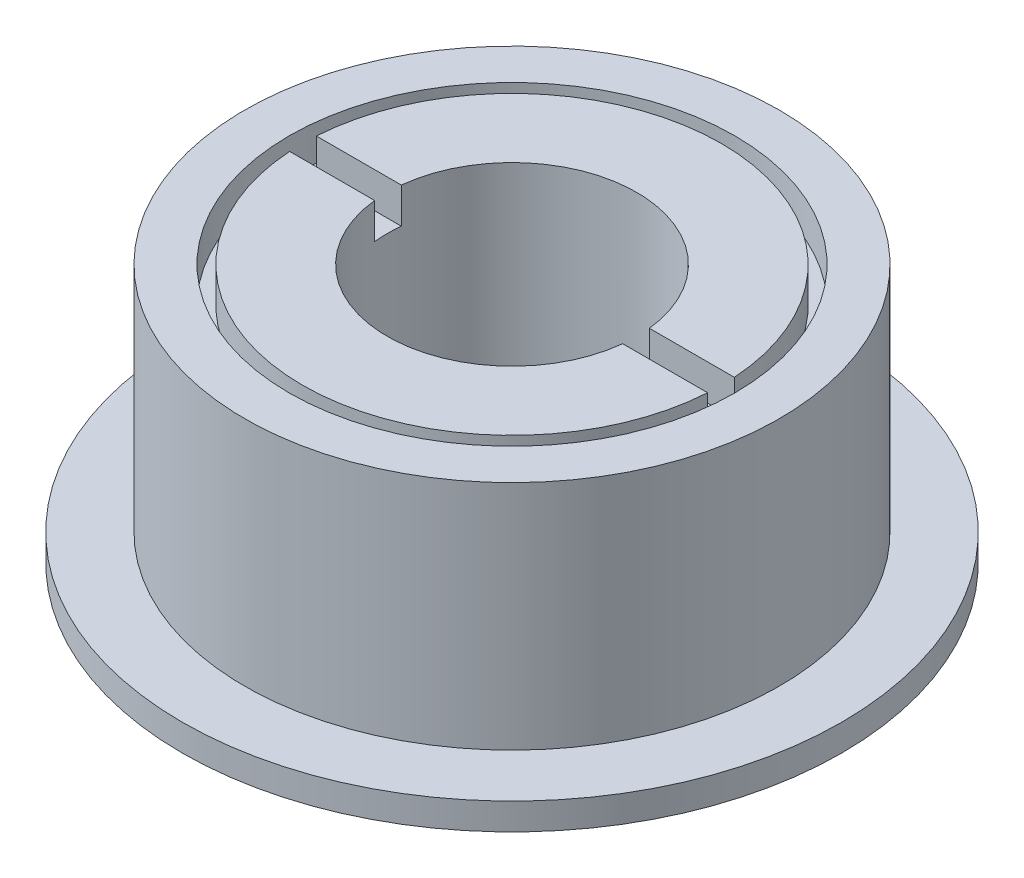
ISO-10303-21;
HEADER;
FILE_DESCRIPTION(('STEP AP214'),'2;1');
FILE_NAME('part.step','',(''),(''),'','','');
FILE_SCHEMA(('AUTOMOTIVE_DESIGN { 1 0 10303 214 1 1 1 1 }'));
ENDSEC;
DATA;
#1=APPLICATION_CONTEXT('core data for automotive mechanical design processes');
#2=APPLICATION_PROTOCOL_DEFINITION('international standard','automotive_design',2000,#1);
#3=PRODUCT_CONTEXT('',#1,'mechanical');
#4=PRODUCT('Part','Part','',(#3));
#5=PRODUCT_RELATED_PRODUCT_CATEGORY('part','',(#4));
#6=PRODUCT_DEFINITION_FORMATION('','',#4);
#7=PRODUCT_DEFINITION_CONTEXT('part definition',#1,'design');
#8=PRODUCT_DEFINITION('design','',#6,#7);
#9=PRODUCT_DEFINITION_SHAPE('','',#8);
#10=(LENGTH_UNIT() NAMED_UNIT(*) SI_UNIT(.MILLI.,.METRE.));
#11=(NAMED_UNIT(*) PLANE_ANGLE_UNIT() SI_UNIT($,.RADIAN.));
#12=(NAMED_UNIT(*) SI_UNIT($,.STERADIAN.) SOLID_ANGLE_UNIT());
#13=UNCERTAINTY_MEASURE_WITH_UNIT(LENGTH_MEASURE(1.E-05),#10,'distance_accuracy_value','');
#14=(GEOMETRIC_REPRESENTATION_CONTEXT(3) GLOBAL_UNCERTAINTY_ASSIGNED_CONTEXT((#13)) GLOBAL_UNIT_ASSIGNED_CONTEXT((#10,
#11,#12)) REPRESENTATION_CONTEXT('',''));
#15=CARTESIAN_POINT('',(0.,0.,0.));
#16=DIRECTION('',(0.,0.,1.));
#17=DIRECTION('',(1.,0.,0.));
#18=AXIS2_PLACEMENT_3D('',#15,#16,#17);
#19=CARTESIAN_POINT('',(0.,3.,0.));
#20=DIRECTION('',(0.,-1.,0.));
#21=DIRECTION('',(0.,0.,-1.));
#22=AXIS2_PLACEMENT_3D('',#19,#20,#21);
#23=CYLINDRICAL_SURFACE('',#22,37.);
#24=CARTESIAN_POINT('',(0.,3.,0.));
#25=DIRECTION('',(0.,1.,0.));
#26=DIRECTION('',(0.,0.,1.));
#27=AXIS2_PLACEMENT_3D('',#24,#25,#26);
#28=CIRCLE('',#27,37.);
#29=CARTESIAN_POINT('',(0.,3.,37.));
#30=VERTEX_POINT('',#29);
#31=EDGE_CURVE('E50',#30,#30,#28,.T.);
#32=ORIENTED_EDGE('',*,*,#31,.F.);
#33=EDGE_LOOP('',(#32));
#34=FACE_BOUND('',#33,.T.);
#35=CARTESIAN_POINT('',(0.,0.,0.));
#36=DIRECTION('',(0.,1.,0.));
#37=DIRECTION('',(0.,0.,1.));
#38=AXIS2_PLACEMENT_3D('',#35,#36,#37);
#39=CIRCLE('',#38,37.);
#40=CARTESIAN_POINT('',(0.,0.,37.));
#41=VERTEX_POINT('',#40);
#42=EDGE_CURVE('E201',#41,#41,#39,.T.);
#43=ORIENTED_EDGE('',*,*,#42,.T.);
#44=EDGE_LOOP('',(#43));
#45=FACE_BOUND('',#44,.T.);
#46=ADVANCED_FACE('F41',(#34,#45),#23,.T.);
#47=CARTESIAN_POINT('',(0.,3.,0.));
#48=DIRECTION('',(0.,1.,0.));
#49=DIRECTION('',(0.,0.,1.));
#50=AXIS2_PLACEMENT_3D('',#47,#48,#49);
#51=PLANE('',#50);
#52=CARTESIAN_POINT('',(0.,3.,0.));
#53=DIRECTION('',(0.,1.,0.));
#54=DIRECTION('',(0.,0.,1.));
#55=AXIS2_PLACEMENT_3D('',#52,#53,#54);
#56=CIRCLE('',#55,30.);
#57=CARTESIAN_POINT('',(0.,3.,-30.));
#58=VERTEX_POINT('',#57);
#59=EDGE_CURVE('E198',#58,#58,#56,.F.);
#60=ORIENTED_EDGE('',*,*,#59,.T.);
#61=EDGE_LOOP('',(#60));
#62=FACE_BOUND('',#61,.T.);
#63=ORIENTED_EDGE('',*,*,#31,.T.);
#64=EDGE_LOOP('',(#63));
#65=FACE_BOUND('',#64,.T.);
#66=ADVANCED_FACE('F238',(#62,#65),#51,.T.);
#67=CARTESIAN_POINT('',(0.,0.,0.));
#68=DIRECTION('',(0.,1.,0.));
#69=DIRECTION('',(0.,0.,1.));
#70=AXIS2_PLACEMENT_3D('',#67,#68,#69);
#71=PLANE('',#70);
#72=CARTESIAN_POINT('',(-8.,0.,0.));
#73=DIRECTION('',(0.,-1.,0.));
#74=DIRECTION('',(0.,0.,-1.));
#75=AXIS2_PLACEMENT_3D('',#72,#73,#74);
#76=CIRCLE('',#75,2.);
#77=CARTESIAN_POINT('',(-8.,0.,-2.));
#78=VERTEX_POINT('',#77);
#79=EDGE_CURVE('E283',#78,#78,#76,.T.);
#80=ORIENTED_EDGE('',*,*,#79,.F.);
#81=EDGE_LOOP('',(#80));
#82=FACE_BOUND('',#81,.T.);
#83=CARTESIAN_POINT('',(0.,0.,8.));
#84=DIRECTION('',(0.,-1.,0.));
#85=DIRECTION('',(0.,0.,-1.));
#86=AXIS2_PLACEMENT_3D('',#83,#84,#85);
#87=CIRCLE('',#86,2.);
#88=CARTESIAN_POINT('',(0.,0.,6.));
#89=VERTEX_POINT('',#88);
#90=EDGE_CURVE('E287',#89,#89,#87,.T.);
#91=ORIENTED_EDGE('',*,*,#90,.F.);
#92=EDGE_LOOP('',(#91));
#93=FACE_BOUND('',#92,.T.);
#94=CARTESIAN_POINT('',(8.,0.,0.));
#95=DIRECTION('',(0.,-1.,0.));
#96=DIRECTION('',(0.,0.,-1.));
#97=AXIS2_PLACEMENT_3D('',#94,#95,#96);
#98=CIRCLE('',#97,2.);
#99=CARTESIAN_POINT('',(8.,0.,-2.00000000000006));
#100=VERTEX_POINT('',#99);
#101=EDGE_CURVE('E291',#100,#100,#98,.T.);
#102=ORIENTED_EDGE('',*,*,#101,.F.);
#103=EDGE_LOOP('',(#102));
#104=FACE_BOUND('',#103,.T.);
#105=CARTESIAN_POINT('',(0.,0.,-8.));
#106=DIRECTION('',(0.,-1.,0.));
#107=DIRECTION('',(0.,0.,-1.));
#108=AXIS2_PLACEMENT_3D('',#105,#106,#107);
#109=CIRCLE('',#108,2.);
#110=CARTESIAN_POINT('',(0.,0.,-10.));
#111=VERTEX_POINT('',#110);
#112=EDGE_CURVE('E295',#111,#111,#109,.T.);
#113=ORIENTED_EDGE('',*,*,#112,.F.);
#114=EDGE_LOOP('',(#113));
#115=FACE_BOUND('',#114,.T.);
#116=CARTESIAN_POINT('',(0.,0.,0.));
#117=DIRECTION('',(0.,-1.,0.));
#118=DIRECTION('',(0.,0.,-1.));
#119=AXIS2_PLACEMENT_3D('',#116,#117,#118);
#120=CIRCLE('',#119,4.);
#121=CARTESIAN_POINT('',(0.,0.,-4.));
#122=VERTEX_POINT('',#121);
#123=EDGE_CURVE('E214',#122,#122,#120,.T.);
#124=ORIENTED_EDGE('',*,*,#123,.F.);
#125=EDGE_LOOP('',(#124));
#126=FACE_BOUND('',#125,.T.);
#127=ORIENTED_EDGE('',*,*,#42,.F.);
#128=EDGE_LOOP('',(#127));
#129=FACE_BOUND('',#128,.T.);
#130=ADVANCED_FACE('F267',(#82,#93,#104,#115,#126,#129),#71,.F.);
#131=CARTESIAN_POINT('',(0.,29.,0.));
#132=DIRECTION('',(0.,-1.,0.));
#133=DIRECTION('',(0.,0.,-1.));
#134=AXIS2_PLACEMENT_3D('',#131,#132,#133);
#135=CYLINDRICAL_SURFACE('',#134,30.);
#136=CARTESIAN_POINT('',(0.,29.,0.));
#137=DIRECTION('',(0.,1.,0.));
#138=DIRECTION('',(0.,0.,1.));
#139=AXIS2_PLACEMENT_3D('',#136,#137,#138);
#140=CIRCLE('',#139,30.);
#141=CARTESIAN_POINT('',(0.,29.,-30.));
#142=VERTEX_POINT('',#141);
#143=EDGE_CURVE('E194',#142,#142,#140,.T.);
#144=CARTESIAN_POINT('',(0.,3.,-30.));
#145=CARTESIAN_POINT('',(0.,3.27083333333333,-30.));
#146=CARTESIAN_POINT('',(0.,3.54166666666666,-30.));
#147=CARTESIAN_POINT('',(0.,4.08333333333333,-30.));
#148=CARTESIAN_POINT('',(0.,4.35416666666666,-30.));
#149=CARTESIAN_POINT('',(0.,4.89583333333333,-30.));
#150=CARTESIAN_POINT('',(0.,5.16666666666666,-30.));
#151=CARTESIAN_POINT('',(0.,5.70833333333333,-30.));
#152=CARTESIAN_POINT('',(0.,5.97916666666667,-30.));
#153=CARTESIAN_POINT('',(0.,6.52083333333333,-30.));
#154=CARTESIAN_POINT('',(0.,6.79166666666667,-30.));
#155=CARTESIAN_POINT('',(0.,7.33333333333333,-30.));
#156=CARTESIAN_POINT('',(0.,7.60416666666666,-30.));
#157=CARTESIAN_POINT('',(0.,8.14583333333333,-30.));
#158=CARTESIAN_POINT('',(0.,8.41666666666666,-30.));
#159=CARTESIAN_POINT('',(0.,8.95833333333333,-30.));
#160=CARTESIAN_POINT('',(0.,9.22916666666666,-30.));
#161=CARTESIAN_POINT('',(0.,9.77083333333333,-30.));
#162=CARTESIAN_POINT('',(0.,10.0416666666667,-30.));
#163=CARTESIAN_POINT('',(0.,10.5833333333333,-30.));
#164=CARTESIAN_POINT('',(0.,10.8541666666667,-30.));
#165=CARTESIAN_POINT('',(0.,11.3958333333333,-30.));
#166=CARTESIAN_POINT('',(0.,11.6666666666667,-30.));
#167=CARTESIAN_POINT('',(0.,12.2083333333333,-30.));
#168=CARTESIAN_POINT('',(0.,12.4791666666667,-30.));
#169=CARTESIAN_POINT('',(0.,13.0208333333333,-30.));
#170=CARTESIAN_POINT('',(0.,13.2916666666667,-30.));
#171=CARTESIAN_POINT('',(0.,13.8333333333333,-30.));
#172=CARTESIAN_POINT('',(0.,14.1041666666667,-30.));
#173=CARTESIAN_POINT('',(0.,14.6458333333333,-30.));
#174=CARTESIAN_POINT('',(0.,14.9166666666667,-30.));
#175=CARTESIAN_POINT('',(0.,15.4583333333333,-30.));
#176=CARTESIAN_POINT('',(0.,15.7291666666667,-30.));
#177=CARTESIAN_POINT('',(0.,16.2708333333333,-30.));
#178=CARTESIAN_POINT('',(0.,16.5416666666667,-30.));
#179=CARTESIAN_POINT('',(0.,17.0833333333333,-30.));
#180=CARTESIAN_POINT('',(0.,17.3541666666667,-30.));
#181=CARTESIAN_POINT('',(0.,17.8958333333333,-30.));
#182=CARTESIAN_POINT('',(0.,18.1666666666667,-30.));
#183=CARTESIAN_POINT('',(0.,18.7083333333333,-30.));
#184=CARTESIAN_POINT('',(0.,18.9791666666667,-30.));
#185=CARTESIAN_POINT('',(0.,19.5208333333333,-30.));
#186=CARTESIAN_POINT('',(0.,19.7916666666667,-30.));
#187=CARTESIAN_POINT('',(0.,20.3333333333333,-30.));
#188=CARTESIAN_POINT('',(0.,20.6041666666667,-30.));
#189=CARTESIAN_POINT('',(0.,21.1458333333333,-30.));
#190=CARTESIAN_POINT('',(0.,21.4166666666667,-30.));
#191=CARTESIAN_POINT('',(0.,21.9583333333333,-30.));
#192=CARTESIAN_POINT('',(0.,22.2291666666667,-30.));
#193=CARTESIAN_POINT('',(0.,22.7708333333333,-30.));
#194=CARTESIAN_POINT('',(0.,23.0416666666667,-30.));
#195=CARTESIAN_POINT('',(0.,23.5833333333333,-30.));
#196=CARTESIAN_POINT('',(0.,23.8541666666667,-30.));
#197=CARTESIAN_POINT('',(0.,24.3958333333333,-30.));
#198=CARTESIAN_POINT('',(0.,24.6666666666667,-30.));
#199=CARTESIAN_POINT('',(0.,25.2083333333333,-30.));
#200=CARTESIAN_POINT('',(0.,25.4791666666667,-30.));
#201=CARTESIAN_POINT('',(0.,26.0208333333333,-30.));
#202=CARTESIAN_POINT('',(0.,26.2916666666667,-30.));
#203=CARTESIAN_POINT('',(0.,26.8333333333333,-30.));
#204=CARTESIAN_POINT('',(0.,27.1041666666667,-30.));
#205=CARTESIAN_POINT('',(0.,27.6458333333333,-30.));
#206=CARTESIAN_POINT('',(0.,27.9166666666667,-30.));
#207=CARTESIAN_POINT('',(0.,28.4583333333333,-30.));
#208=CARTESIAN_POINT('',(0.,28.7291666666667,-30.));
#209=CARTESIAN_POINT('',(0.,29.,-30.));
#210=B_SPLINE_CURVE_WITH_KNOTS('',3,(#144,#145,#146,#147,#148,#149,#150,#151,#152,#153,#154,
#155,#156,#157,#158,#159,#160,#161,#162,#163,#164,#165,#166,#167,#168,#169,#170,#171,#172,#173,
#174,#175,#176,#177,#178,#179,#180,#181,#182,#183,#184,#185,#186,#187,#188,#189,#190,#191,#192,
#193,#194,#195,#196,#197,#198,#199,#200,#201,#202,#203,#204,#205,#206,#207,#208,#209),
.UNSPECIFIED.,.F.,.F.,(4,2,2,2,2,2,2,2,2,2,2,2,2,2,2,2,2,2,2,2,2,2,2,2,2,2,2,2,2,2,2,2,4),(0.,
0.812500000000001,1.625,2.4375,3.25,4.0625,4.875,5.6875,6.5,7.3125,8.125,8.9375,9.75,10.5625,
11.375,12.1875,13.,13.8125,14.625,15.4375,16.25,17.0625,17.875,18.6875,19.5,20.3125,21.125,
21.9375,22.75,23.5625,24.375,25.1875,26.),.UNSPECIFIED.);
#211=EDGE_CURVE('BSEAM274',#58,#142,#210,.T.);
#212=ORIENTED_EDGE('',*,*,#59,.F.);
#213=ORIENTED_EDGE('',*,*,#143,.F.);
#214=ORIENTED_EDGE('',*,*,#211,.T.);
#215=ORIENTED_EDGE('',*,*,#211,.F.);
#216=EDGE_LOOP('',(#212,#214,#213,#215));
#217=FACE_BOUND('',#216,.T.);
#218=ADVANCED_FACE('F274',(#217),#135,.T.);
#219=CARTESIAN_POINT('',(0.,29.,0.));
#220=DIRECTION('',(0.,1.,0.));
#221=DIRECTION('',(0.,0.,1.));
#222=AXIS2_PLACEMENT_3D('',#219,#220,#221);
#223=PLANE('',#222);
#224=CARTESIAN_POINT('',(0.,29.,0.));
#225=DIRECTION('',(0.,1.,0.));
#226=DIRECTION('',(0.,0.,1.));
#227=AXIS2_PLACEMENT_3D('',#224,#225,#226);
#228=CIRCLE('',#227,25.);
#229=CARTESIAN_POINT('',(0.,29.,25.));
#230=VERTEX_POINT('',#229);
#231=EDGE_CURVE('E168',#230,#230,#228,.T.);
#232=ORIENTED_EDGE('',*,*,#231,.F.);
#233=EDGE_LOOP('',(#232));
#234=FACE_BOUND('',#233,.T.);
#235=ORIENTED_EDGE('',*,*,#143,.T.);
#236=EDGE_LOOP('',(#235));
#237=FACE_BOUND('',#236,.T.);
#238=ADVANCED_FACE('F260',(#234,#237),#223,.T.);
#239=CARTESIAN_POINT('',(0.,25.,0.));
#240=DIRECTION('',(0.,1.,0.));
#241=DIRECTION('',(0.,0.,1.));
#242=AXIS2_PLACEMENT_3D('',#239,#240,#241);
#243=CYLINDRICAL_SURFACE('',#242,23.5);
#244=CARTESIAN_POINT('',(0.,29.,0.));
#245=DIRECTION('',(0.,1.,0.));
#246=DIRECTION('',(0.,0.,1.));
#247=AXIS2_PLACEMENT_3D('',#244,#245,#246);
#248=CIRCLE('',#247,23.5);
#249=CARTESIAN_POINT('',(-23.4520787991172,29.,1.5));
#250=VERTEX_POINT('',#249);
#251=CARTESIAN_POINT('',(23.4520787991172,29.,1.5));
#252=VERTEX_POINT('',#251);
#253=EDGE_CURVE('E58',#250,#252,#248,.T.);
#254=ORIENTED_EDGE('',*,*,#253,.F.);
#255=DIRECTION('',(0.,1.,0.));
#256=VECTOR('',#255,1.);
#257=CARTESIAN_POINT('',(-23.4520787991172,25.,1.5));
#258=LINE('',#257,#256);
#259=CARTESIAN_POINT('',(-23.4520787991172,25.,1.5));
#260=VERTEX_POINT('',#259);
#261=EDGE_CURVE('E94',#260,#250,#258,.T.);
#262=ORIENTED_EDGE('',*,*,#261,.F.);
#263=CARTESIAN_POINT('',(0.,25.,0.));
#264=DIRECTION('',(0.,1.,0.));
#265=DIRECTION('',(0.,0.,1.));
#266=AXIS2_PLACEMENT_3D('',#263,#264,#265);
#267=CIRCLE('',#266,23.5);
#268=CARTESIAN_POINT('',(23.4520787991172,25.,1.5));
#269=VERTEX_POINT('',#268);
#270=EDGE_CURVE('E64',#260,#269,#267,.T.);
#271=ORIENTED_EDGE('',*,*,#270,.T.);
#272=DIRECTION('',(0.,1.,0.));
#273=VECTOR('',#272,1.);
#274=CARTESIAN_POINT('',(23.4520787991172,25.,1.5));
#275=LINE('',#274,#273);
#276=EDGE_CURVE('E90',#269,#252,#275,.T.);
#277=ORIENTED_EDGE('',*,*,#276,.T.);
#278=EDGE_LOOP('',(#254,#262,#271,#277));
#279=FACE_BOUND('',#278,.T.);
#280=ADVANCED_FACE('F349',(#279),#243,.T.);
#281=CARTESIAN_POINT('',(0.,25.,1.5));
#282=DIRECTION('',(0.,0.,1.));
#283=DIRECTION('',(1.,0.,0.));
#284=AXIS2_PLACEMENT_3D('',#281,#282,#283);
#285=PLANE('',#284);
#286=DIRECTION('',(1.,0.,0.));
#287=VECTOR('',#286,1.);
#288=CARTESIAN_POINT('',(0.,29.,1.5));
#289=LINE('',#288,#287);
#290=CARTESIAN_POINT('',(13.9194109070751,29.,1.5));
#291=VERTEX_POINT('',#290);
#292=EDGE_CURVE('E165',#291,#252,#289,.T.);
#293=ORIENTED_EDGE('',*,*,#292,.T.);
#294=ORIENTED_EDGE('',*,*,#276,.F.);
#295=DIRECTION('',(1.,0.,0.));
#296=VECTOR('',#295,1.);
#297=CARTESIAN_POINT('',(0.,25.,1.5));
#298=LINE('',#297,#296);
#299=CARTESIAN_POINT('',(13.9194109070751,25.,1.5));
#300=VERTEX_POINT('',#299);
#301=EDGE_CURVE('E140',#300,#269,#298,.T.);
#302=ORIENTED_EDGE('',*,*,#301,.F.);
#303=DIRECTION('',(0.,1.,0.));
#304=VECTOR('',#303,1.);
#305=CARTESIAN_POINT('',(13.9194109070751,25.,1.5));
#306=LINE('',#305,#304);
#307=EDGE_CURVE('E121',#300,#291,#306,.T.);
#308=ORIENTED_EDGE('',*,*,#307,.T.);
#309=EDGE_LOOP('',(#293,#294,#302,#308));
#310=FACE_BOUND('',#309,.T.);
#311=ADVANCED_FACE('F335',(#310),#285,.F.);
#312=CARTESIAN_POINT('',(0.,25.,-1.5));
#313=DIRECTION('',(0.,0.,1.));
#314=DIRECTION('',(1.,0.,0.));
#315=AXIS2_PLACEMENT_3D('',#312,#313,#314);
#316=PLANE('',#315);
#317=DIRECTION('',(1.,0.,0.));
#318=VECTOR('',#317,1.);
#319=CARTESIAN_POINT('',(0.,29.,-1.5));
#320=LINE('',#319,#318);
#321=CARTESIAN_POINT('',(13.9194109070751,29.,-1.5));
#322=VERTEX_POINT('',#321);
#323=CARTESIAN_POINT('',(23.4520787991172,29.,-1.5));
#324=VERTEX_POINT('',#323);
#325=EDGE_CURVE('E115',#322,#324,#320,.T.);
#326=ORIENTED_EDGE('',*,*,#325,.F.);
#327=DIRECTION('',(0.,1.,0.));
#328=VECTOR('',#327,1.);
#329=CARTESIAN_POINT('',(13.9194109070751,25.,-1.5));
#330=LINE('',#329,#328);
#331=CARTESIAN_POINT('',(13.9194109070751,25.,-1.5));
#332=VERTEX_POINT('',#331);
#333=EDGE_CURVE('E109',#332,#322,#330,.T.);
#334=ORIENTED_EDGE('',*,*,#333,.F.);
#335=DIRECTION('',(1.,0.,0.));
#336=VECTOR('',#335,1.);
#337=CARTESIAN_POINT('',(0.,25.,-1.5));
#338=LINE('',#337,#336);
#339=CARTESIAN_POINT('',(23.4520787991172,25.,-1.5));
#340=VERTEX_POINT('',#339);
#341=EDGE_CURVE('E112',#332,#340,#338,.T.);
#342=ORIENTED_EDGE('',*,*,#341,.T.);
#343=DIRECTION('',(0.,1.,0.));
#344=VECTOR('',#343,1.);
#345=CARTESIAN_POINT('',(23.4520787991172,25.,-1.5));
#346=LINE('',#345,#344);
#347=EDGE_CURVE('E122',#340,#324,#346,.T.);
#348=ORIENTED_EDGE('',*,*,#347,.T.);
#349=EDGE_LOOP('',(#326,#334,#342,#348));
#350=FACE_BOUND('',#349,.T.);
#351=ADVANCED_FACE('F111',(#350),#316,.T.);
#352=CARTESIAN_POINT('',(0.,25.,0.));
#353=DIRECTION('',(0.,1.,0.));
#354=DIRECTION('',(0.,0.,1.));
#355=AXIS2_PLACEMENT_3D('',#352,#353,#354);
#356=CYLINDRICAL_SURFACE('',#355,23.5);
#357=CARTESIAN_POINT('',(0.,29.,0.));
#358=DIRECTION('',(0.,1.,0.));
#359=DIRECTION('',(0.,0.,1.));
#360=AXIS2_PLACEMENT_3D('',#357,#358,#359);
#361=CIRCLE('',#360,23.5);
#362=CARTESIAN_POINT('',(-23.4520787991172,29.,-1.5));
#363=VERTEX_POINT('',#362);
#364=EDGE_CURVE('E159',#324,#363,#361,.T.);
#365=ORIENTED_EDGE('',*,*,#364,.F.);
#366=ORIENTED_EDGE('',*,*,#347,.F.);
#367=CARTESIAN_POINT('',(0.,25.,0.));
#368=DIRECTION('',(0.,1.,0.));
#369=DIRECTION('',(0.,0.,1.));
#370=AXIS2_PLACEMENT_3D('',#367,#368,#369);
#371=CIRCLE('',#370,23.5);
#372=CARTESIAN_POINT('',(-23.4520787991172,25.,-1.5));
#373=VERTEX_POINT('',#372);
#374=EDGE_CURVE('E132',#340,#373,#371,.T.);
#375=ORIENTED_EDGE('',*,*,#374,.T.);
#376=DIRECTION('',(0.,1.,0.));
#377=VECTOR('',#376,1.);
#378=CARTESIAN_POINT('',(-23.4520787991172,25.,-1.5));
#379=LINE('',#378,#377);
#380=EDGE_CURVE('E179',#373,#363,#379,.T.);
#381=ORIENTED_EDGE('',*,*,#380,.T.);
#382=EDGE_LOOP('',(#365,#366,#375,#381));
#383=FACE_BOUND('',#382,.T.);
#384=ADVANCED_FACE('F321',(#383),#356,.T.);
#385=CARTESIAN_POINT('',(0.,25.,-1.5));
#386=DIRECTION('',(0.,0.,1.));
#387=DIRECTION('',(1.,0.,0.));
#388=AXIS2_PLACEMENT_3D('',#385,#386,#387);
#389=PLANE('',#388);
#390=DIRECTION('',(1.,0.,0.));
#391=VECTOR('',#390,1.);
#392=CARTESIAN_POINT('',(0.,29.,-1.5));
#393=LINE('',#392,#391);
#394=CARTESIAN_POINT('',(-13.9194109070751,29.,-1.5));
#395=VERTEX_POINT('',#394);
#396=EDGE_CURVE('E155',#363,#395,#393,.T.);
#397=ORIENTED_EDGE('',*,*,#396,.F.);
#398=ORIENTED_EDGE('',*,*,#380,.F.);
#399=DIRECTION('',(1.,0.,0.));
#400=VECTOR('',#399,1.);
#401=CARTESIAN_POINT('',(0.,25.,-1.5));
#402=LINE('',#401,#400);
#403=CARTESIAN_POINT('',(-13.9194109070751,25.,-1.5));
#404=VERTEX_POINT('',#403);
#405=EDGE_CURVE('E315',#373,#404,#402,.T.);
#406=ORIENTED_EDGE('',*,*,#405,.T.);
#407=DIRECTION('',(0.,1.,0.));
#408=VECTOR('',#407,1.);
#409=CARTESIAN_POINT('',(-13.9194109070751,25.,-1.5));
#410=LINE('',#409,#408);
#411=EDGE_CURVE('E182',#404,#395,#410,.T.);
#412=ORIENTED_EDGE('',*,*,#411,.T.);
#413=EDGE_LOOP('',(#397,#398,#406,#412));
#414=FACE_BOUND('',#413,.T.);
#415=ADVANCED_FACE('F324',(#414),#389,.T.);
#416=CARTESIAN_POINT('',(0.,25.,1.5));
#417=DIRECTION('',(0.,0.,1.));
#418=DIRECTION('',(1.,0.,0.));
#419=AXIS2_PLACEMENT_3D('',#416,#417,#418);
#420=PLANE('',#419);
#421=DIRECTION('',(1.,0.,0.));
#422=VECTOR('',#421,1.);
#423=CARTESIAN_POINT('',(0.,29.,1.5));
#424=LINE('',#423,#422);
#425=CARTESIAN_POINT('',(-13.9194109070751,29.,1.5));
#426=VERTEX_POINT('',#425);
#427=EDGE_CURVE('E152',#250,#426,#424,.T.);
#428=ORIENTED_EDGE('',*,*,#427,.T.);
#429=DIRECTION('',(0.,1.,0.));
#430=VECTOR('',#429,1.);
#431=CARTESIAN_POINT('',(-13.9194109070751,25.,1.5));
#432=LINE('',#431,#430);
#433=CARTESIAN_POINT('',(-13.9194109070751,25.,1.5));
#434=VERTEX_POINT('',#433);
#435=EDGE_CURVE('E185',#434,#426,#432,.T.);
#436=ORIENTED_EDGE('',*,*,#435,.F.);
#437=DIRECTION('',(1.,0.,0.));
#438=VECTOR('',#437,1.);
#439=CARTESIAN_POINT('',(0.,25.,1.5));
#440=LINE('',#439,#438);
#441=EDGE_CURVE('E307',#260,#434,#440,.T.);
#442=ORIENTED_EDGE('',*,*,#441,.F.);
#443=ORIENTED_EDGE('',*,*,#261,.T.);
#444=EDGE_LOOP('',(#428,#436,#442,#443));
#445=FACE_BOUND('',#444,.T.);
#446=ADVANCED_FACE('F336',(#445),#420,.F.);
#447=CARTESIAN_POINT('',(0.,25.,0.));
#448=DIRECTION('',(0.,1.,0.));
#449=DIRECTION('',(0.,0.,1.));
#450=AXIS2_PLACEMENT_3D('',#447,#448,#449);
#451=CYLINDRICAL_SURFACE('',#450,25.);
#452=CARTESIAN_POINT('',(0.,25.,0.));
#453=DIRECTION('',(0.,1.,0.));
#454=DIRECTION('',(0.,0.,1.));
#455=AXIS2_PLACEMENT_3D('',#452,#453,#454);
#456=CIRCLE('',#455,25.);
#457=CARTESIAN_POINT('',(0.,25.,25.));
#458=VERTEX_POINT('',#457);
#459=EDGE_CURVE('E143',#458,#458,#456,.T.);
#460=ORIENTED_EDGE('',*,*,#459,.F.);
#461=EDGE_LOOP('',(#460));
#462=FACE_BOUND('',#461,.T.);
#463=ORIENTED_EDGE('',*,*,#231,.T.);
#464=EDGE_LOOP('',(#463));
#465=FACE_BOUND('',#464,.T.);
#466=ADVANCED_FACE('F338',(#462,#465),#451,.F.);
#467=CARTESIAN_POINT('',(0.,25.,0.));
#468=DIRECTION('',(0.,1.,0.));
#469=DIRECTION('',(0.,0.,1.));
#470=AXIS2_PLACEMENT_3D('',#467,#468,#469);
#471=PLANE('',#470);
#472=ORIENTED_EDGE('',*,*,#270,.F.);
#473=ORIENTED_EDGE('',*,*,#441,.T.);
#474=CARTESIAN_POINT('',(0.,25.,0.));
#475=DIRECTION('',(0.,1.,0.));
#476=DIRECTION('',(0.,0.,1.));
#477=AXIS2_PLACEMENT_3D('',#474,#475,#476);
#478=CIRCLE('',#477,14.);
#479=EDGE_CURVE('E311',#434,#404,#478,.F.);
#480=ORIENTED_EDGE('',*,*,#479,.T.);
#481=ORIENTED_EDGE('',*,*,#405,.F.);
#482=ORIENTED_EDGE('',*,*,#374,.F.);
#483=ORIENTED_EDGE('',*,*,#341,.F.);
#484=CARTESIAN_POINT('',(0.,25.,0.));
#485=DIRECTION('',(0.,1.,0.));
#486=DIRECTION('',(0.,0.,1.));
#487=AXIS2_PLACEMENT_3D('',#484,#485,#486);
#488=CIRCLE('',#487,14.);
#489=EDGE_CURVE('E129',#332,#300,#488,.F.);
#490=ORIENTED_EDGE('',*,*,#489,.T.);
#491=ORIENTED_EDGE('',*,*,#301,.T.);
#492=EDGE_LOOP('',(#472,#473,#480,#481,#482,#483,#490,#491));
#493=FACE_BOUND('',#492,.T.);
#494=ORIENTED_EDGE('',*,*,#459,.T.);
#495=EDGE_LOOP('',(#494));
#496=FACE_BOUND('',#495,.T.);
#497=ADVANCED_FACE('F126',(#493,#496),#471,.T.);
#498=CARTESIAN_POINT('',(-8.,3.,0.));
#499=DIRECTION('',(0.,1.,0.));
#500=DIRECTION('',(0.,0.,1.));
#501=AXIS2_PLACEMENT_3D('',#498,#499,#500);
#502=CIRCLE('',#501,2.);
#503=CARTESIAN_POINT('',(-8.,3.,2.));
#504=VERTEX_POINT('',#503);
#505=EDGE_CURVE('E44',#504,#504,#502,.T.);
#506=ORIENTED_EDGE('',*,*,#505,.F.);
#507=EDGE_LOOP('',(#506));
#508=FACE_BOUND('',#507,.T.);
#509=CARTESIAN_POINT('',(0.,3.,8.));
#510=DIRECTION('',(0.,1.,0.));
#511=DIRECTION('',(0.,0.,1.));
#512=AXIS2_PLACEMENT_3D('',#509,#510,#511);
#513=CIRCLE('',#512,2.);
#514=CARTESIAN_POINT('',(0.,3.,10.));
#515=VERTEX_POINT('',#514);
#516=EDGE_CURVE('E221',#515,#515,#513,.T.);
#517=ORIENTED_EDGE('',*,*,#516,.F.);
#518=EDGE_LOOP('',(#517));
#519=FACE_BOUND('',#518,.T.);
#520=CARTESIAN_POINT('',(8.,3.,0.));
#521=DIRECTION('',(0.,1.,0.));
#522=DIRECTION('',(0.,0.,1.));
#523=AXIS2_PLACEMENT_3D('',#520,#521,#522);
#524=CIRCLE('',#523,2.);
#525=CARTESIAN_POINT('',(8.,3.,1.99999999999994));
#526=VERTEX_POINT('',#525);
#527=EDGE_CURVE('E218',#526,#526,#524,.T.);
#528=ORIENTED_EDGE('',*,*,#527,.F.);
#529=EDGE_LOOP('',(#528));
#530=FACE_BOUND('',#529,.T.);
#531=CARTESIAN_POINT('',(0.,3.,-8.));
#532=DIRECTION('',(0.,1.,0.));
#533=DIRECTION('',(0.,0.,1.));
#534=AXIS2_PLACEMENT_3D('',#531,#532,#533);
#535=CIRCLE('',#534,2.);
#536=CARTESIAN_POINT('',(0.,3.,-6.));
#537=VERTEX_POINT('',#536);
#538=EDGE_CURVE('E213',#537,#537,#535,.T.);
#539=ORIENTED_EDGE('',*,*,#538,.F.);
#540=EDGE_LOOP('',(#539));
#541=FACE_BOUND('',#540,.T.);
#542=CARTESIAN_POINT('',(0.,3.,0.));
#543=DIRECTION('',(0.,1.,0.));
#544=DIRECTION('',(0.,0.,1.));
#545=AXIS2_PLACEMENT_3D('',#542,#543,#544);
#546=CIRCLE('',#545,4.);
#547=CARTESIAN_POINT('',(0.,3.,4.));
#548=VERTEX_POINT('',#547);
#549=EDGE_CURVE('E209',#548,#548,#546,.T.);
#550=ORIENTED_EDGE('',*,*,#549,.F.);
#551=EDGE_LOOP('',(#550));
#552=FACE_BOUND('',#551,.T.);
#553=CARTESIAN_POINT('',(0.,3.,0.));
#554=DIRECTION('',(0.,1.,0.));
#555=DIRECTION('',(0.,0.,1.));
#556=AXIS2_PLACEMENT_3D('',#553,#554,#555);
#557=CIRCLE('',#556,14.);
#558=CARTESIAN_POINT('',(0.,3.,14.));
#559=VERTEX_POINT('',#558);
#560=EDGE_CURVE('E11',#559,#559,#557,.F.);
#561=ORIENTED_EDGE('',*,*,#560,.F.);
#562=EDGE_LOOP('',(#561));
#563=FACE_BOUND('',#562,.T.);
#564=ADVANCED_FACE('F233',(#508,#519,#530,#541,#552,#563),#51,.T.);
#565=ORIENTED_EDGE('',*,*,#292,.F.);
#566=CARTESIAN_POINT('',(0.,29.,0.));
#567=DIRECTION('',(0.,1.,0.));
#568=DIRECTION('',(0.,0.,1.));
#569=AXIS2_PLACEMENT_3D('',#566,#567,#568);
#570=CIRCLE('',#569,14.);
#571=EDGE_CURVE('E174',#426,#291,#570,.T.);
#572=ORIENTED_EDGE('',*,*,#571,.F.);
#573=ORIENTED_EDGE('',*,*,#427,.F.);
#574=ORIENTED_EDGE('',*,*,#253,.T.);
#575=EDGE_LOOP('',(#565,#572,#573,#574));
#576=FACE_BOUND('',#575,.T.);
#577=ADVANCED_FACE('F236',(#576),#223,.T.);
#578=EDGE_CURVE('E193',#322,#395,#570,.T.);
#579=ORIENTED_EDGE('',*,*,#578,.F.);
#580=ORIENTED_EDGE('',*,*,#325,.T.);
#581=ORIENTED_EDGE('',*,*,#364,.T.);
#582=ORIENTED_EDGE('',*,*,#396,.T.);
#583=EDGE_LOOP('',(#579,#580,#581,#582));
#584=FACE_BOUND('',#583,.T.);
#585=ADVANCED_FACE('F249',(#584),#223,.T.);
#586=CARTESIAN_POINT('',(0.,29.,0.));
#587=DIRECTION('',(0.,-1.,0.));
#588=DIRECTION('',(0.,0.,-1.));
#589=AXIS2_PLACEMENT_3D('',#586,#587,#588);
#590=CYLINDRICAL_SURFACE('',#589,14.);
#591=ORIENTED_EDGE('',*,*,#307,.F.);
#592=ORIENTED_EDGE('',*,*,#489,.F.);
#593=ORIENTED_EDGE('',*,*,#333,.T.);
#594=ORIENTED_EDGE('',*,*,#578,.T.);
#595=ORIENTED_EDGE('',*,*,#411,.F.);
#596=ORIENTED_EDGE('',*,*,#479,.F.);
#597=ORIENTED_EDGE('',*,*,#435,.T.);
#598=ORIENTED_EDGE('',*,*,#571,.T.);
#599=EDGE_LOOP('',(#591,#592,#593,#594,#595,#596,#597,#598));
#600=FACE_BOUND('',#599,.T.);
#601=ORIENTED_EDGE('',*,*,#560,.T.);
#602=EDGE_LOOP('',(#601));
#603=FACE_BOUND('',#602,.T.);
#604=ADVANCED_FACE('F136',(#600,#603),#590,.F.);
#605=CARTESIAN_POINT('',(0.,4.,0.));
#606=DIRECTION('',(0.,-1.,0.));
#607=DIRECTION('',(0.,0.,-1.));
#608=AXIS2_PLACEMENT_3D('',#605,#606,#607);
#609=CYLINDRICAL_SURFACE('',#608,4.);
#610=ORIENTED_EDGE('',*,*,#549,.T.);
#611=EDGE_LOOP('',(#610));
#612=FACE_BOUND('',#611,.T.);
#613=ORIENTED_EDGE('',*,*,#123,.T.);
#614=EDGE_LOOP('',(#613));
#615=FACE_BOUND('',#614,.T.);
#616=ADVANCED_FACE('F248',(#612,#615),#609,.F.);
#617=CARTESIAN_POINT('',(0.,4.,-8.));
#618=DIRECTION('',(0.,-1.,0.));
#619=DIRECTION('',(0.,0.,-1.));
#620=AXIS2_PLACEMENT_3D('',#617,#618,#619);
#621=CYLINDRICAL_SURFACE('',#620,2.);
#622=ORIENTED_EDGE('',*,*,#538,.T.);
#623=EDGE_LOOP('',(#622));
#624=FACE_BOUND('',#623,.T.);
#625=ORIENTED_EDGE('',*,*,#112,.T.);
#626=EDGE_LOOP('',(#625));
#627=FACE_BOUND('',#626,.T.);
#628=ADVANCED_FACE('F255',(#624,#627),#621,.F.);
#629=CARTESIAN_POINT('',(8.,4.,0.));
#630=DIRECTION('',(0.,-1.,0.));
#631=DIRECTION('',(0.,0.,-1.));
#632=AXIS2_PLACEMENT_3D('',#629,#630,#631);
#633=CYLINDRICAL_SURFACE('',#632,2.);
#634=ORIENTED_EDGE('',*,*,#527,.T.);
#635=EDGE_LOOP('',(#634));
#636=FACE_BOUND('',#635,.T.);
#637=ORIENTED_EDGE('',*,*,#101,.T.);
#638=EDGE_LOOP('',(#637));
#639=FACE_BOUND('',#638,.T.);
#640=ADVANCED_FACE('F399',(#636,#639),#633,.F.);
#641=CARTESIAN_POINT('',(0.,4.,8.));
#642=DIRECTION('',(0.,-1.,0.));
#643=DIRECTION('',(0.,0.,-1.));
#644=AXIS2_PLACEMENT_3D('',#641,#642,#643);
#645=CYLINDRICAL_SURFACE('',#644,2.);
#646=ORIENTED_EDGE('',*,*,#516,.T.);
#647=EDGE_LOOP('',(#646));
#648=FACE_BOUND('',#647,.T.);
#649=ORIENTED_EDGE('',*,*,#90,.T.);
#650=EDGE_LOOP('',(#649));
#651=FACE_BOUND('',#650,.T.);
#652=ADVANCED_FACE('F409',(#648,#651),#645,.F.);
#653=CARTESIAN_POINT('',(-8.,4.,0.));
#654=DIRECTION('',(0.,-1.,0.));
#655=DIRECTION('',(0.,0.,-1.));
#656=AXIS2_PLACEMENT_3D('',#653,#654,#655);
#657=CYLINDRICAL_SURFACE('',#656,2.);
#658=ORIENTED_EDGE('',*,*,#505,.T.);
#659=EDGE_LOOP('',(#658));
#660=FACE_BOUND('',#659,.T.);
#661=ORIENTED_EDGE('',*,*,#79,.T.);
#662=EDGE_LOOP('',(#661));
#663=FACE_BOUND('',#662,.T.);
#664=ADVANCED_FACE('F230',(#660,#663),#657,.F.);
#665=CLOSED_SHELL('',(#46,#66,#130,#218,#238,#280,#311,#351,#384,#415,#446,#466,#497,#564,#577,
#585,#604,#616,#628,#640,#652,#664));
#666=MANIFOLD_SOLID_BREP('B2',#665);
#667=ADVANCED_BREP_SHAPE_REPRESENTATION('',(#18,#666),#14);
#668=SHAPE_DEFINITION_REPRESENTATION(#9,#667);
ENDSEC;
END-ISO-10303-21;
